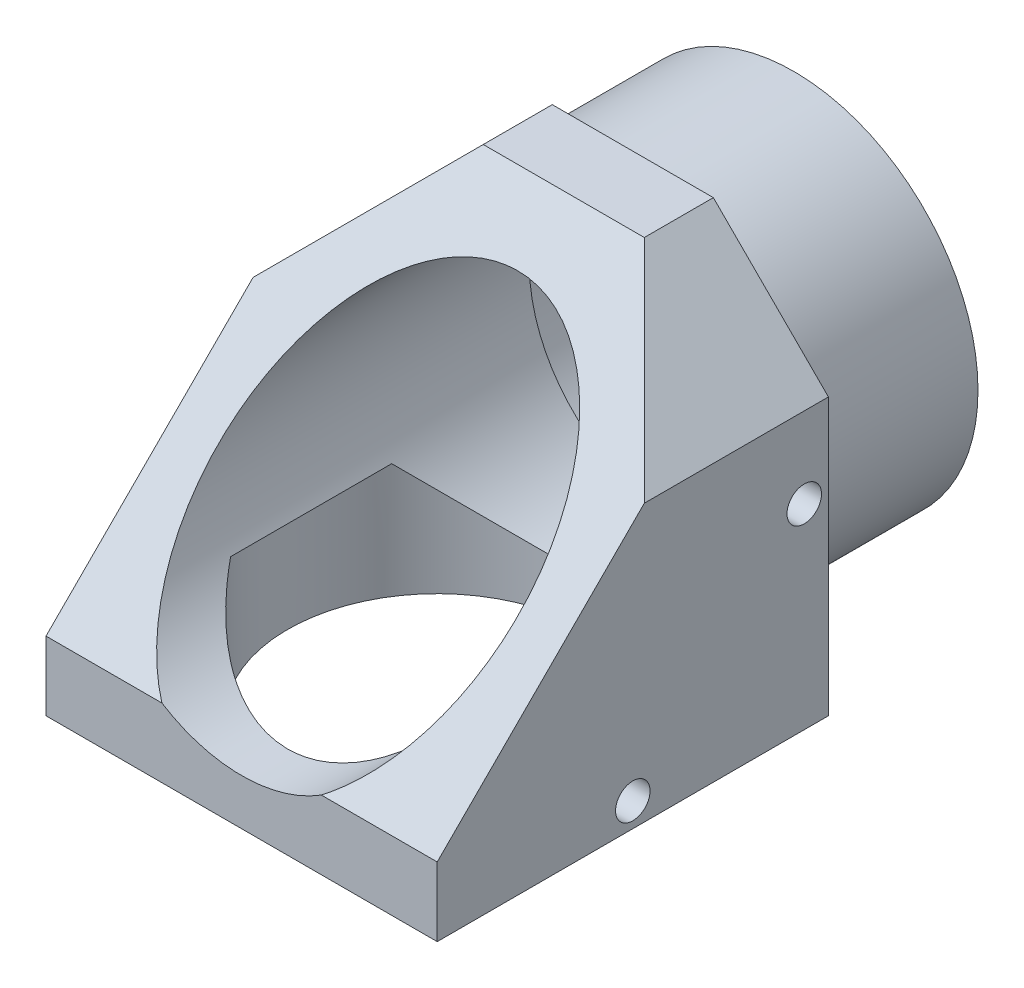
ISO-10303-21;
HEADER;
FILE_DESCRIPTION(('STEP AP214'),'2;1');
FILE_NAME('part.step','',(''),(''),'','','');
FILE_SCHEMA(('AUTOMOTIVE_DESIGN { 1 0 10303 214 1 1 1 1 }'));
ENDSEC;
DATA;
#1=APPLICATION_CONTEXT('core data for automotive mechanical design processes');
#2=APPLICATION_PROTOCOL_DEFINITION('international standard','automotive_design',2000,#1);
#3=PRODUCT_CONTEXT('',#1,'mechanical');
#4=PRODUCT('Part','Part','',(#3));
#5=PRODUCT_RELATED_PRODUCT_CATEGORY('part','',(#4));
#6=PRODUCT_DEFINITION_FORMATION('','',#4);
#7=PRODUCT_DEFINITION_CONTEXT('part definition',#1,'design');
#8=PRODUCT_DEFINITION('design','',#6,#7);
#9=PRODUCT_DEFINITION_SHAPE('','',#8);
#10=(LENGTH_UNIT() NAMED_UNIT(*) SI_UNIT(.MILLI.,.METRE.));
#11=(NAMED_UNIT(*) PLANE_ANGLE_UNIT() SI_UNIT($,.RADIAN.));
#12=(NAMED_UNIT(*) SI_UNIT($,.STERADIAN.) SOLID_ANGLE_UNIT());
#13=UNCERTAINTY_MEASURE_WITH_UNIT(LENGTH_MEASURE(1.E-05),#10,'distance_accuracy_value','');
#14=(GEOMETRIC_REPRESENTATION_CONTEXT(3) GLOBAL_UNCERTAINTY_ASSIGNED_CONTEXT((#13)) GLOBAL_UNIT_ASSIGNED_CONTEXT((#10,
#11,#12)) REPRESENTATION_CONTEXT('',''));
#15=CARTESIAN_POINT('',(0.,0.,0.));
#16=DIRECTION('',(0.,0.,1.));
#17=DIRECTION('',(1.,0.,0.));
#18=AXIS2_PLACEMENT_3D('',#15,#16,#17);
#19=CARTESIAN_POINT('',(17.,-17.0000000000001,-48.));
#20=DIRECTION('',(-1.,0.,0.));
#21=DIRECTION('',(0.,0.,-1.));
#22=AXIS2_PLACEMENT_3D('',#19,#20,#21);
#23=PLANE('',#22);
#24=CARTESIAN_POINT('',(17.,0.,-31.9));
#25=DIRECTION('',(1.,0.,0.));
#26=DIRECTION('',(0.,0.,-1.));
#27=AXIS2_PLACEMENT_3D('',#24,#25,#26);
#28=CIRCLE('',#27,1.5);
#29=CARTESIAN_POINT('',(17.,0.,-33.4));
#30=VERTEX_POINT('',#29);
#31=EDGE_CURVE('E353',#30,#30,#28,.T.);
#32=ORIENTED_EDGE('',*,*,#31,.F.);
#33=EDGE_LOOP('',(#32));
#34=FACE_BOUND('',#33,.T.);
#35=DIRECTION('',(0.,1.,0.));
#36=VECTOR('',#35,1.);
#37=CARTESIAN_POINT('',(17.,-17.0000000000001,-34.));
#38=LINE('',#37,#36);
#39=CARTESIAN_POINT('',(17.,-17.0000000000001,-34.));
#40=VERTEX_POINT('',#39);
#41=CARTESIAN_POINT('',(17.,6.99999999999994,-34.));
#42=VERTEX_POINT('',#41);
#43=EDGE_CURVE('E174',#40,#42,#38,.T.);
#44=ORIENTED_EDGE('',*,*,#43,.T.);
#45=DIRECTION('',(0.,0.,-1.));
#46=VECTOR('',#45,1.);
#47=CARTESIAN_POINT('',(17.,6.99999999999988,-48.));
#48=LINE('',#47,#46);
#49=CARTESIAN_POINT('',(17.,6.99999999999994,-18.0000000000003));
#50=VERTEX_POINT('',#49);
#51=EDGE_CURVE('E226',#50,#42,#48,.T.);
#52=ORIENTED_EDGE('',*,*,#51,.F.);
#53=DIRECTION('',(0.,0.707106781186544,-0.707106781186551));
#54=VECTOR('',#53,1.);
#55=CARTESIAN_POINT('',(17.,17.,-28.0000000000005));
#56=LINE('',#55,#54);
#57=CARTESIAN_POINT('',(17.,-11.0000000000002,0.));
#58=VERTEX_POINT('',#57);
#59=EDGE_CURVE('E45',#58,#50,#56,.T.);
#60=ORIENTED_EDGE('',*,*,#59,.F.);
#61=DIRECTION('',(0.,1.,0.));
#62=VECTOR('',#61,1.);
#63=CARTESIAN_POINT('',(17.,-17.0000000000001,0.));
#64=LINE('',#63,#62);
#65=CARTESIAN_POINT('',(17.,-17.0000000000001,0.));
#66=VERTEX_POINT('',#65);
#67=EDGE_CURVE('E202',#66,#58,#64,.T.);
#68=ORIENTED_EDGE('',*,*,#67,.F.);
#69=DIRECTION('',(0.,0.,1.));
#70=VECTOR('',#69,1.);
#71=CARTESIAN_POINT('',(17.,-17.0000000000001,-48.));
#72=LINE('',#71,#70);
#73=EDGE_CURVE('E210',#40,#66,#72,.T.);
#74=ORIENTED_EDGE('',*,*,#73,.F.);
#75=EDGE_LOOP('',(#44,#52,#60,#68,#74));
#76=FACE_BOUND('',#75,.T.);
#77=CARTESIAN_POINT('',(17.,-14.9,-17.));
#78=DIRECTION('',(1.,0.,0.));
#79=DIRECTION('',(0.,0.,-1.));
#80=AXIS2_PLACEMENT_3D('',#77,#78,#79);
#81=CIRCLE('',#80,1.5);
#82=CARTESIAN_POINT('',(17.,-14.9,-18.5));
#83=VERTEX_POINT('',#82);
#84=EDGE_CURVE('E350',#83,#83,#81,.T.);
#85=ORIENTED_EDGE('',*,*,#84,.F.);
#86=EDGE_LOOP('',(#85));
#87=FACE_BOUND('',#86,.T.);
#88=ADVANCED_FACE('F37',(#34,#76,#87),#23,.F.);
#89=CARTESIAN_POINT('',(0.,-7.00000000000005,-17.));
#90=DIRECTION('',(0.,-1.,0.));
#91=DIRECTION('',(0.,0.,1.));
#92=AXIS2_PLACEMENT_3D('',#89,#90,#91);
#93=CYLINDRICAL_SURFACE('',#92,13.);
#94=CARTESIAN_POINT('',(0.,-17.0000000000001,-17.));
#95=DIRECTION('',(0.,1.,0.));
#96=DIRECTION('',(0.,0.,1.));
#97=AXIS2_PLACEMENT_3D('',#94,#95,#96);
#98=CIRCLE('',#97,13.);
#99=CARTESIAN_POINT('',(0.,-17.0000000000001,-4.));
#100=VERTEX_POINT('',#99);
#101=EDGE_CURVE('E179',#100,#100,#98,.T.);
#102=ORIENTED_EDGE('',*,*,#101,.F.);
#103=EDGE_LOOP('',(#102));
#104=FACE_BOUND('',#103,.T.);
#105=CARTESIAN_POINT('',(0.,0.,-17.));
#106=DIRECTION('',(0.,0.707106781186547,-0.707106781186547));
#107=DIRECTION('',(0.,0.707106781186548,0.707106781186547));
#108=AXIS2_PLACEMENT_3D('',#105,#106,#107);
#109=ELLIPSE('',#108,18.3847763108502,13.);
#110=CARTESIAN_POINT('',(-10.9544511501034,-7.00000000000005,-24.));
#111=VERTEX_POINT('',#110);
#112=CARTESIAN_POINT('',(10.9544511501033,-7.00000000000002,-24.));
#113=VERTEX_POINT('',#112);
#114=EDGE_CURVE('E189',#111,#113,#109,.F.);
#115=ORIENTED_EDGE('',*,*,#114,.F.);
#116=CARTESIAN_POINT('',(0.,-7.00000000000005,-17.));
#117=DIRECTION('',(0.,1.,0.));
#118=DIRECTION('',(0.,0.,1.));
#119=AXIS2_PLACEMENT_3D('',#116,#117,#118);
#120=CIRCLE('',#119,13.);
#121=CARTESIAN_POINT('',(-10.9544511501034,-7.00000000000005,-9.99999999999998));
#122=VERTEX_POINT('',#121);
#123=EDGE_CURVE('E184',#111,#122,#120,.T.);
#124=ORIENTED_EDGE('',*,*,#123,.T.);
#125=CARTESIAN_POINT('',(0.,0.,-17.));
#126=DIRECTION('',(0.,-0.707106781186548,-0.707106781186547));
#127=DIRECTION('',(0.,-0.707106781186547,0.707106781186547));
#128=AXIS2_PLACEMENT_3D('',#125,#126,#127);
#129=ELLIPSE('',#128,18.3847763108502,13.);
#130=CARTESIAN_POINT('',(10.9544511501033,-7.00000000000006,-9.99999999999998));
#131=VERTEX_POINT('',#130);
#132=EDGE_CURVE('E183',#131,#122,#129,.T.);
#133=ORIENTED_EDGE('',*,*,#132,.F.);
#134=EDGE_CURVE('E180',#131,#113,#120,.T.);
#135=ORIENTED_EDGE('',*,*,#134,.T.);
#136=EDGE_LOOP('',(#115,#124,#133,#135));
#137=FACE_BOUND('',#136,.T.);
#138=CARTESIAN_POINT('',(12.9131715701449,-14.9,-18.5));
#139=CARTESIAN_POINT('',(12.9131726932068,-14.9839542172997,-18.4999964013091));
#140=CARTESIAN_POINT('',(12.9139991388253,-15.0679621566454,-18.4929279243701));
#141=CARTESIAN_POINT('',(12.9172147015517,-15.2336437023459,-18.4648400830477));
#142=CARTESIAN_POINT('',(12.9196054881851,-15.3153147173395,-18.4438058134747));
#143=CARTESIAN_POINT('',(12.9256754079296,-15.4738994148837,-18.3884115875902));
#144=CARTESIAN_POINT('',(12.9293537048583,-15.5508161470808,-18.3540602785695));
#145=CARTESIAN_POINT('',(12.9375831784509,-15.6977775575172,-18.2730248511306));
#146=CARTESIAN_POINT('',(12.9421341959707,-15.7678234851614,-18.226342980656));
#147=CARTESIAN_POINT('',(12.9516207455651,-15.8994057764391,-18.1217317645875));
#148=CARTESIAN_POINT('',(12.9565578374542,-15.9609045029651,-18.0637552146803));
#149=CARTESIAN_POINT('',(12.9662461748247,-16.0733219524831,-17.9383017639823));
#150=CARTESIAN_POINT('',(12.9709974113621,-16.1242401668117,-17.8708244066972));
#151=CARTESIAN_POINT('',(12.9797944757482,-16.2141844677572,-17.7280503313319));
#152=CARTESIAN_POINT('',(12.98383828536,-16.2531767600233,-17.6527321886752));
#153=CARTESIAN_POINT('',(12.9907477847743,-16.3179460292017,-17.4965625894714));
#154=CARTESIAN_POINT('',(12.9936135121185,-16.3437234272362,-17.4157113093432));
#155=CARTESIAN_POINT('',(12.997832983891,-16.3812194665391,-17.2511539028343));
#156=CARTESIAN_POINT('',(12.9991934291785,-16.3930004312582,-17.1674621520276));
#157=CARTESIAN_POINT('',(13.0002718988949,-16.4023622088192,-16.9992791279829));
#158=CARTESIAN_POINT('',(12.9999899789058,-16.3999435022151,-16.9147878818985));
#159=CARTESIAN_POINT('',(12.9978209293695,-16.381024804668,-16.7478279018511));
#160=CARTESIAN_POINT('',(12.9959414402013,-16.3645918357374,-16.6653514602571));
#161=CARTESIAN_POINT('',(12.9907970880194,-16.3182157078116,-16.5043349442444));
#162=CARTESIAN_POINT('',(12.9875322020161,-16.2882723246206,-16.4257949351719));
#163=CARTESIAN_POINT('',(12.9799708183318,-16.2156531717194,-16.2746717067593));
#164=CARTESIAN_POINT('',(12.9756719534236,-16.1729481298311,-16.2021026768103));
#165=CARTESIAN_POINT('',(12.966524152931,-16.0760391745798,-16.0651361789808));
#166=CARTESIAN_POINT('',(12.9616751958488,-16.0218348117465,-16.0007390306694));
#167=CARTESIAN_POINT('',(12.9519371499703,-15.9030898527588,-15.8815510257837));
#168=CARTESIAN_POINT('',(12.9470479919323,-15.8384908889184,-15.8268183090959));
#169=CARTESIAN_POINT('',(12.9378085801023,-15.7009917205283,-15.7289639732215));
#170=CARTESIAN_POINT('',(12.9334583275811,-15.6280914964038,-15.6858423814153));
#171=CARTESIAN_POINT('',(12.9257891770563,-15.4760103025,-15.6124325217978));
#172=CARTESIAN_POINT('',(12.9224706181887,-15.396827278166,-15.5821484727286));
#173=CARTESIAN_POINT('',(12.9172473972585,-15.2344531233975,-15.535322621253));
#174=CARTESIAN_POINT('',(12.9153426774327,-15.1512621568575,-15.5187802574186));
#175=CARTESIAN_POINT('',(12.9131731548214,-14.9837458232959,-15.4999834407579));
#176=CARTESIAN_POINT('',(12.9128989839497,-14.899429731566,-15.4976473659746));
#177=CARTESIAN_POINT('',(12.9139968511577,-14.7316073630657,-15.5071144904687));
#178=CARTESIAN_POINT('',(12.9153688594531,-14.6481010716711,-15.5189174339285));
#179=CARTESIAN_POINT('',(12.9195959589165,-14.4845105904106,-15.5562590054518));
#180=CARTESIAN_POINT('',(12.9224468231212,-14.4044173475113,-15.5817584924786));
#181=CARTESIAN_POINT('',(12.9293069915862,-14.2496440469503,-15.6457291608637));
#182=CARTESIAN_POINT('',(12.9333163307988,-14.1749641526995,-15.6842007336076));
#183=CARTESIAN_POINT('',(12.9420642431406,-14.0327670205826,-15.7732257421032));
#184=CARTESIAN_POINT('',(12.9468060265184,-13.9652836386942,-15.8238329345565));
#185=CARTESIAN_POINT('',(12.9564743034368,-13.8397397077759,-15.9356162064136));
#186=CARTESIAN_POINT('',(12.9614008030784,-13.7816794703229,-15.9967926351518));
#187=CARTESIAN_POINT('',(12.9709120031807,-13.6763453756226,-16.1283333588313));
#188=CARTESIAN_POINT('',(12.9754949370269,-13.6291249942273,-16.198740621529));
#189=CARTESIAN_POINT('',(12.9837765169352,-13.5471802030376,-16.3465341184599));
#190=CARTESIAN_POINT('',(12.9874751785286,-13.5124555737648,-16.423920230085));
#191=CARTESIAN_POINT('',(12.9935635841,-13.4565772477665,-16.5832933505922));
#192=CARTESIAN_POINT('',(12.9959563619373,-13.4353920760901,-16.6652692032788));
#193=CARTESIAN_POINT('',(12.9991759401563,-13.4070914991468,-16.8316437294043));
#194=CARTESIAN_POINT('',(13.0000028001968,-13.3999755578652,-16.9160423104169));
#195=CARTESIAN_POINT('',(12.9999972013656,-13.4000244275846,-17.0843431264141));
#196=CARTESIAN_POINT('',(12.9991743496425,-13.4071065556679,-17.1682453978403));
#197=CARTESIAN_POINT('',(12.9959808096935,-13.4351761221973,-17.3336592169468));
#198=CARTESIAN_POINT('',(12.9936101215025,-13.4561635603309,-17.4151707646809));
#199=CARTESIAN_POINT('',(12.9875862426145,-13.5114232435689,-17.5734826057158));
#200=CARTESIAN_POINT('',(12.9839333745424,-13.54569214699,-17.65028407847));
#201=CARTESIAN_POINT('',(12.9757507257432,-13.6265333985612,-17.797058803003));
#202=CARTESIAN_POINT('',(12.9712209408992,-13.6731058044754,-17.8670320227216));
#203=CARTESIAN_POINT('',(12.9617593260845,-13.7775399165321,-17.9985870950489));
#204=CARTESIAN_POINT('',(12.9568253919963,-13.8354632203995,-18.0601198995243));
#205=CARTESIAN_POINT('',(12.9471288614201,-13.9608287274507,-18.1726259529445));
#206=CARTESIAN_POINT('',(12.9423663059907,-14.0282731928934,-18.2235966851828));
#207=CARTESIAN_POINT('',(12.9335349717853,-14.1710185374043,-18.3136721475152));
#208=CARTESIAN_POINT('',(12.9294685391664,-14.2463446575214,-18.3527370834638));
#209=CARTESIAN_POINT('',(12.9225174865264,-14.4024900799745,-18.4176092060689));
#210=CARTESIAN_POINT('',(12.9196315622315,-14.48330320427,-18.443431032304));
#211=CARTESIAN_POINT('',(12.9160801955002,-14.6204594284936,-18.4747957085219));
#212=CARTESIAN_POINT('',(12.9149947793777,-14.6759322719504,-18.4842340066211));
#213=CARTESIAN_POINT('',(12.9135400928901,-14.7875953845718,-18.4968373380594));
#214=CARTESIAN_POINT('',(12.9131708181613,-14.8437856493629,-18.5000024096237));
#215=CARTESIAN_POINT('',(12.9131715701449,-14.9,-18.5));
#216=B_SPLINE_CURVE_WITH_KNOTS('',3,(#138,#139,#140,#141,#142,#143,#144,#145,#146,#147,#148,
#149,#150,#151,#152,#153,#154,#155,#156,#157,#158,#159,#160,#161,#162,#163,#164,#165,#166,#167,
#168,#169,#170,#171,#172,#173,#174,#175,#176,#177,#178,#179,#180,#181,#182,#183,#184,#185,#186,
#187,#188,#189,#190,#191,#192,#193,#194,#195,#196,#197,#198,#199,#200,#201,#202,#203,#204,#205,
#206,#207,#208,#209,#210,#211,#212,#213,#214,#215),.UNSPECIFIED.,.T.,.F.,(4,2,2,2,2,2,2,2,2,2,2,
2,2,2,2,2,2,2,2,2,2,2,2,2,2,2,2,2,2,2,2,2,2,2,2,2,2,2,4),(0.,0.25165732370461,0.503583664907433,
0.755346693442458,1.00706385553886,1.25985651676711,1.5126613283139,1.76617601105996,
2.01968261449443,2.27205611924455,2.52442108306367,2.77558585790614,3.02675480080053,
3.27850434573874,3.53026373254707,3.78348957406516,4.03671601271496,4.29002560360385,
4.54332484481022,4.79516737460205,5.0470053478671,5.29812743542829,5.54925710036775,
5.80152043045275,6.05379209994299,6.30728275635408,6.56076896017989,6.81366372459469,
7.06654885394691,7.31796557646896,7.5693822933401,7.82073579352366,8.0720904738142,
8.32484896253006,8.57766760888503,8.83132224048158,9.08469586220932,9.25320245654525,
9.42170802410546),.UNSPECIFIED.);
#217=CARTESIAN_POINT('',(12.9131715701449,-14.9,-18.5));
#218=VERTEX_POINT('',#217);
#219=EDGE_CURVE('E348',#218,#218,#216,.T.);
#220=ORIENTED_EDGE('',*,*,#219,.F.);
#221=EDGE_LOOP('',(#220));
#222=FACE_BOUND('',#221,.T.);
#223=ADVANCED_FACE('F274',(#104,#137,#222),#93,.F.);
#224=CARTESIAN_POINT('',(0.,0.,-48.));
#225=DIRECTION('',(0.,0.,1.));
#226=DIRECTION('',(-1.,0.,0.));
#227=AXIS2_PLACEMENT_3D('',#224,#225,#226);
#228=CYLINDRICAL_SURFACE('',#227,13.);
#229=ORIENTED_EDGE('',*,*,#114,.T.);
#230=DIRECTION('',(0.,0.,1.));
#231=VECTOR('',#230,1.);
#232=CARTESIAN_POINT('',(10.9544511501033,-7.00000000000008,-48.));
#233=LINE('',#232,#231);
#234=EDGE_CURVE('E216',#131,#113,#233,.F.);
#235=ORIENTED_EDGE('',*,*,#234,.F.);
#236=ORIENTED_EDGE('',*,*,#132,.T.);
#237=DIRECTION('',(0.,0.,1.));
#238=VECTOR('',#237,1.);
#239=CARTESIAN_POINT('',(-10.9544511501034,-7.00000000000002,-48.));
#240=LINE('',#239,#238);
#241=EDGE_CURVE('E220',#111,#122,#240,.T.);
#242=ORIENTED_EDGE('',*,*,#241,.F.);
#243=EDGE_LOOP('',(#229,#235,#236,#242));
#244=FACE_BOUND('',#243,.T.);
#245=CARTESIAN_POINT('',(0.,0.,0.));
#246=DIRECTION('',(0.,0.,1.));
#247=DIRECTION('',(1.,0.,0.));
#248=AXIS2_PLACEMENT_3D('',#245,#246,#247);
#249=CIRCLE('',#248,13.);
#250=CARTESIAN_POINT('',(-6.92820323027521,-11.0000000000002,0.));
#251=VERTEX_POINT('',#250);
#252=CARTESIAN_POINT('',(6.92820323027515,-11.0000000000002,0.));
#253=VERTEX_POINT('',#252);
#254=EDGE_CURVE('E199',#251,#253,#249,.T.);
#255=ORIENTED_EDGE('',*,*,#254,.T.);
#256=CARTESIAN_POINT('',(0.,0.,-11.0000000000003));
#257=DIRECTION('',(0.,-0.707106781186551,-0.707106781186543));
#258=DIRECTION('',(0.,-0.707106781186544,0.707106781186551));
#259=AXIS2_PLACEMENT_3D('',#256,#257,#258);
#260=ELLIPSE('',#259,18.3847763108503,13.);
#261=EDGE_CURVE('E243',#251,#253,#260,.T.);
#262=ORIENTED_EDGE('',*,*,#261,.F.);
#263=EDGE_LOOP('',(#255,#262));
#264=FACE_BOUND('',#263,.T.);
#265=CARTESIAN_POINT('',(0.,0.,-38.));
#266=DIRECTION('',(0.,0.,1.));
#267=DIRECTION('',(1.,0.,0.));
#268=AXIS2_PLACEMENT_3D('',#265,#266,#267);
#269=CIRCLE('',#268,13.);
#270=CARTESIAN_POINT('',(12.9999999999999,0.,-38.));
#271=VERTEX_POINT('',#270);
#272=EDGE_CURVE('E196',#271,#271,#269,.T.);
#273=ORIENTED_EDGE('',*,*,#272,.F.);
#274=EDGE_LOOP('',(#273));
#275=FACE_BOUND('',#274,.T.);
#276=CARTESIAN_POINT('',(13.,0.,-33.4));
#277=CARTESIAN_POINT('',(12.9999989044515,0.0839563147427269,-33.3999964031671));
#278=CARTESIAN_POINT('',(12.9991780815721,0.167966345196167,-33.3929275849652));
#279=CARTESIAN_POINT('',(12.995982599614,0.333652235419356,-33.3648382649666));
#280=CARTESIAN_POINT('',(12.99360628136,0.415325505475647,-33.3438028653164));
#281=CARTESIAN_POINT('',(12.9875677351869,0.573914972249207,-33.2884053338573));
#282=CARTESIAN_POINT('',(12.9839063366206,0.650834199520668,-33.2540517956906));
#283=CARTESIAN_POINT('',(12.9757057473599,0.797799793787114,-33.1730111181213));
#284=CARTESIAN_POINT('',(12.9711667170809,0.867847413269111,-33.1263262321012));
#285=CARTESIAN_POINT('',(12.9616943551208,0.999427807179217,-33.0217119644012));
#286=CARTESIAN_POINT('',(12.9567594432832,1.06092347729179,-32.9637360526227));
#287=CARTESIAN_POINT('',(12.9470643855765,1.17333502414492,-32.8382851632475));
#288=CARTESIAN_POINT('',(12.9423042482743,1.22425038284187,-32.7708097207966));
#289=CARTESIAN_POINT('',(12.9334819604022,1.31419168733337,-32.6280373361048));
#290=CARTESIAN_POINT('',(12.9294218388056,1.35318331715726,-32.5527186399223));
#291=CARTESIAN_POINT('',(12.9224797052986,1.41795120910935,-32.3965478380412));
#292=CARTESIAN_POINT('',(12.9195976551561,1.44372790011124,-32.3156959120129));
#293=CARTESIAN_POINT('',(12.9153528047107,1.48122247723764,-32.1511364753763));
#294=CARTESIAN_POINT('',(12.9139832786549,1.49300261981043,-32.0674433262594));
#295=CARTESIAN_POINT('',(12.9128978570992,1.50236226854611,-31.8992575604559));
#296=CARTESIAN_POINT('',(12.9131819045903,1.49994226427624,-31.8147649714311));
#297=CARTESIAN_POINT('',(12.9153653842397,1.48102150197292,-31.6478106867289));
#298=CARTESIAN_POINT('',(12.9172569773873,1.46458907258949,-31.5653411304074));
#299=CARTESIAN_POINT('',(12.9224301836669,1.41821640637184,-31.4043381059818));
#300=CARTESIAN_POINT('',(12.9257118211341,1.38827593305337,-31.3258047068143));
#301=CARTESIAN_POINT('',(12.9333043079058,1.31566282618378,-31.1746895307639));
#302=CARTESIAN_POINT('',(12.9376175732259,1.27296024500282,-31.1021222704977));
#303=CARTESIAN_POINT('',(12.9467853893456,1.17605655290092,-30.9651582704928));
#304=CARTESIAN_POINT('',(12.9516399612475,1.1218549936306,-30.9007618494945));
#305=CARTESIAN_POINT('',(12.9613782949516,1.00311203599147,-30.7815707161917));
#306=CARTESIAN_POINT('',(12.9662620604919,0.938511694342099,-30.7268347087021));
#307=CARTESIAN_POINT('',(12.9754816969276,0.801008592235985,-30.6289743878324));
#308=CARTESIAN_POINT('',(12.9798175668566,0.728105817136063,-30.5858500949327));
#309=CARTESIAN_POINT('',(12.9874550212077,0.576023905679844,-30.5124382871552));
#310=CARTESIAN_POINT('',(12.9907563324875,0.496843118716597,-30.4821541615714));
#311=CARTESIAN_POINT('',(12.9959501177405,0.334473831095718,-30.4353274726576));
#312=CARTESIAN_POINT('',(12.9978426478647,0.251285490311355,-30.418784361637));
#313=CARTESIAN_POINT('',(12.999998373659,0.0837704200049993,-30.3999847236204));
#314=CARTESIAN_POINT('',(13.0002707984128,-0.000547113543221205,-30.3976472710681));
#315=CARTESIAN_POINT('',(12.9991804669134,-0.168372695685032,-30.407112154611));
#316=CARTESIAN_POINT('',(12.9978177402297,-0.251880758889253,-30.4189142350122));
#317=CARTESIAN_POINT('',(12.993616027243,-0.415480266956191,-30.456255972808));
#318=CARTESIAN_POINT('',(12.9907811576039,-0.495580568872927,-30.4817573287087));
#319=CARTESIAN_POINT('',(12.9839527929212,-0.650367161714392,-30.545734096229));
#320=CARTESIAN_POINT('',(12.9799592639146,-0.725053293857149,-30.5842098881644));
#321=CARTESIAN_POINT('',(12.9712363785455,-0.867254744569807,-30.6732411451229));
#322=CARTESIAN_POINT('',(12.9665038451426,-0.934736878832517,-30.7238492959128));
#323=CARTESIAN_POINT('',(12.9568430886348,-1.06027784673841,-30.8356337448151));
#324=CARTESIAN_POINT('',(12.9519148589511,-1.11833636324618,-30.8968103984492));
#325=CARTESIAN_POINT('',(12.9423899602444,-1.22366664140003,-31.028350385336));
#326=CARTESIAN_POINT('',(12.9377950067668,-1.27088497439803,-31.0987566435089));
#327=CARTESIAN_POINT('',(12.9294843210235,-1.3528261731532,-31.2465475758449));
#328=CARTESIAN_POINT('',(12.9257685733743,-1.38754925754464,-31.3239321278765));
#329=CARTESIAN_POINT('',(12.9196483466478,-1.44342658284104,-31.4833061537355));
#330=CARTESIAN_POINT('',(12.91724089246,-1.46461162925539,-31.5652847079303));
#331=CARTESIAN_POINT('',(12.9140010380224,-1.4929110406227,-31.7316649395143));
#332=CARTESIAN_POINT('',(12.9131685761467,-1.5000259561095,-31.8160665219645));
#333=CARTESIAN_POINT('',(12.913174563178,-1.49997405326829,-31.9843656537594));
#334=CARTESIAN_POINT('',(12.9140031925958,-1.49289116482705,-32.068263241811));
#335=CARTESIAN_POINT('',(12.9172169582805,-1.46482172327177,-32.2336675019932));
#336=CARTESIAN_POINT('',(12.9196020954322,-1.44383516225565,-32.315174172765));
#337=CARTESIAN_POINT('',(12.9256572251488,-1.38857911797313,-32.4734760916893));
#338=CARTESIAN_POINT('',(12.9293268880955,-1.35431304208046,-32.5502725425812));
#339=CARTESIAN_POINT('',(12.9375381901497,-1.27347900341472,-32.6970384003879));
#340=CARTESIAN_POINT('',(12.9420798337501,-1.22691097725308,-32.7670077721221));
#341=CARTESIAN_POINT('',(12.9515555600008,-1.12248173071091,-32.8985629533293));
#342=CARTESIAN_POINT('',(12.9564917239034,-1.06455790771253,-32.960098921175));
#343=CARTESIAN_POINT('',(12.9661816355574,-0.939190054186341,-33.0726111148908));
#344=CARTESIAN_POINT('',(12.9709353397598,-0.871743768617598,-33.1235848324088));
#345=CARTESIAN_POINT('',(12.9797415177439,-0.728996893197141,-33.2136635640703));
#346=CARTESIAN_POINT('',(12.9837916526637,-0.653671391511472,-33.2527293056854));
#347=CARTESIAN_POINT('',(12.9907101076694,-0.497527270565922,-33.3176031050395));
#348=CARTESIAN_POINT('',(12.993579731148,-0.416714824913427,-33.3434257921356));
#349=CARTESIAN_POINT('',(12.9971099824635,-0.279556305332071,-33.3747928548381));
#350=CARTESIAN_POINT('',(12.9981885527758,-0.224080319679984,-33.3842322271337));
#351=CARTESIAN_POINT('',(12.9996339262189,-0.112410914672208,-33.3968369852807));
#352=CARTESIAN_POINT('',(13.0000007335839,-0.0562174995863383,-33.4000024084544));
#353=CARTESIAN_POINT('',(13.,0.,-33.4));
#354=B_SPLINE_CURVE_WITH_KNOTS('',3,(#276,#277,#278,#279,#280,#281,#282,#283,#284,#285,#286,
#287,#288,#289,#290,#291,#292,#293,#294,#295,#296,#297,#298,#299,#300,#301,#302,#303,#304,#305,
#306,#307,#308,#309,#310,#311,#312,#313,#314,#315,#316,#317,#318,#319,#320,#321,#322,#323,#324,
#325,#326,#327,#328,#329,#330,#331,#332,#333,#334,#335,#336,#337,#338,#339,#340,#341,#342,#343,
#344,#345,#346,#347,#348,#349,#350,#351,#352,#353),.UNSPECIFIED.,.T.,.F.,(4,2,2,2,2,2,2,2,2,2,2,
2,2,2,2,2,2,2,2,2,2,2,2,2,2,2,2,2,2,2,2,2,2,2,2,2,2,2,4),(0.,0.251663624421975,
0.503596125244163,0.755366334321087,1.00709056767771,1.25987498270023,1.51267177188699,
1.7661893968867,2.01969879377991,2.2720763120158,2.52444512928253,2.77559031440107,
3.02673989646909,3.2784835178067,3.53023695652506,3.7834711988091,4.03670588773469,
4.29000737900443,4.54329877367691,4.79514587715499,5.04698842639316,5.29813049175019,
5.54927991940193,5.80154039645153,6.05380936112789,6.307296210909,6.56077862511547,
6.81368217226278,7.06657582364481,7.3179789106833,7.56938214060556,7.82072090595904,
8.07206096641735,8.32482769676522,8.57765438622355,8.83130609524227,9.08467699305619,
9.25319301127892,9.42170802703667),.UNSPECIFIED.);
#355=CARTESIAN_POINT('',(13.,0.,-33.4));
#356=VERTEX_POINT('',#355);
#357=EDGE_CURVE('E370',#356,#356,#354,.T.);
#358=ORIENTED_EDGE('',*,*,#357,.T.);
#359=EDGE_LOOP('',(#358));
#360=FACE_BOUND('',#359,.T.);
#361=ADVANCED_FACE('F280',(#244,#264,#275,#360),#228,.F.);
#362=CARTESIAN_POINT('',(0.,0.,-38.));
#363=DIRECTION('',(0.,0.,-1.));
#364=DIRECTION('',(1.,0.,0.));
#365=AXIS2_PLACEMENT_3D('',#362,#363,#364);
#366=CYLINDRICAL_SURFACE('',#365,13.5);
#367=CARTESIAN_POINT('',(0.,0.,-46.));
#368=DIRECTION('',(0.,0.,-1.));
#369=DIRECTION('',(-1.,0.,0.));
#370=AXIS2_PLACEMENT_3D('',#367,#368,#369);
#371=CIRCLE('',#370,13.5);
#372=CARTESIAN_POINT('',(-13.5,0.,-46.));
#373=VERTEX_POINT('',#372);
#374=EDGE_CURVE('E375',#373,#373,#371,.T.);
#375=ORIENTED_EDGE('',*,*,#374,.T.);
#376=EDGE_LOOP('',(#375));
#377=FACE_BOUND('',#376,.T.);
#378=CARTESIAN_POINT('',(0.,0.,-38.));
#379=DIRECTION('',(0.,0.,1.));
#380=DIRECTION('',(1.,0.,0.));
#381=AXIS2_PLACEMENT_3D('',#378,#379,#380);
#382=CIRCLE('',#381,13.5);
#383=CARTESIAN_POINT('',(13.4999999999999,0.,-38.));
#384=VERTEX_POINT('',#383);
#385=EDGE_CURVE('E193',#384,#384,#382,.T.);
#386=ORIENTED_EDGE('',*,*,#385,.T.);
#387=EDGE_LOOP('',(#386));
#388=FACE_BOUND('',#387,.T.);
#389=ADVANCED_FACE('F321',(#377,#388),#366,.F.);
#390=CARTESIAN_POINT('',(17.,17.,-48.));
#391=DIRECTION('',(0.,0.,1.));
#392=DIRECTION('',(-1.,0.,0.));
#393=AXIS2_PLACEMENT_3D('',#390,#391,#392);
#394=PLANE('',#393);
#395=CARTESIAN_POINT('',(0.,0.,-48.));
#396=DIRECTION('',(0.,0.,1.));
#397=DIRECTION('',(1.,0.,0.));
#398=AXIS2_PLACEMENT_3D('',#395,#396,#397);
#399=CIRCLE('',#398,13.5);
#400=CARTESIAN_POINT('',(13.5,0.,-48.));
#401=VERTEX_POINT('',#400);
#402=EDGE_CURVE('E192',#401,#401,#399,.T.);
#403=ORIENTED_EDGE('',*,*,#402,.T.);
#404=EDGE_LOOP('',(#403));
#405=FACE_BOUND('',#404,.T.);
#406=CARTESIAN_POINT('',(0.,0.,-48.));
#407=DIRECTION('',(0.,0.,1.));
#408=DIRECTION('',(1.,0.,0.));
#409=AXIS2_PLACEMENT_3D('',#406,#407,#408);
#410=CIRCLE('',#409,16.);
#411=CARTESIAN_POINT('',(16.,0.,-48.));
#412=VERTEX_POINT('',#411);
#413=EDGE_CURVE('E159',#412,#412,#410,.T.);
#414=ORIENTED_EDGE('',*,*,#413,.F.);
#415=EDGE_LOOP('',(#414));
#416=FACE_BOUND('',#415,.T.);
#417=ADVANCED_FACE('F318',(#405,#416),#394,.F.);
#418=CARTESIAN_POINT('',(-17.,16.9999999999999,-48.));
#419=DIRECTION('',(0.,-1.,0.));
#420=DIRECTION('',(0.,0.,1.));
#421=AXIS2_PLACEMENT_3D('',#418,#419,#420);
#422=PLANE('',#421);
#423=DIRECTION('',(-1.,0.,0.));
#424=VECTOR('',#423,1.);
#425=CARTESIAN_POINT('',(17.,17.,-34.));
#426=LINE('',#425,#424);
#427=CARTESIAN_POINT('',(6.99999999999995,17.,-34.));
#428=VERTEX_POINT('',#427);
#429=CARTESIAN_POINT('',(-7.00000000000001,16.9999999999999,-34.));
#430=VERTEX_POINT('',#429);
#431=EDGE_CURVE('E163',#428,#430,#426,.T.);
#432=ORIENTED_EDGE('',*,*,#431,.T.);
#433=DIRECTION('',(0.,0.,-1.));
#434=VECTOR('',#433,1.);
#435=CARTESIAN_POINT('',(-6.99999999999995,16.9999999999999,-48.));
#436=LINE('',#435,#434);
#437=CARTESIAN_POINT('',(-6.99999999999995,16.9999999999999,-28.0000000000005));
#438=VERTEX_POINT('',#437);
#439=EDGE_CURVE('E222',#438,#430,#436,.T.);
#440=ORIENTED_EDGE('',*,*,#439,.F.);
#441=DIRECTION('',(-1.,0.,0.));
#442=VECTOR('',#441,1.);
#443=CARTESIAN_POINT('',(-6.99999999999995,16.9999999999999,-28.0000000000005));
#444=LINE('',#443,#442);
#445=CARTESIAN_POINT('',(6.99999999999995,16.9999999999999,-28.0000000000005));
#446=VERTEX_POINT('',#445);
#447=EDGE_CURVE('E231',#446,#438,#444,.T.);
#448=ORIENTED_EDGE('',*,*,#447,.F.);
#449=DIRECTION('',(0.,0.,1.));
#450=VECTOR('',#449,1.);
#451=CARTESIAN_POINT('',(6.99999999999995,17.,-48.));
#452=LINE('',#451,#450);
#453=EDGE_CURVE('E224',#428,#446,#452,.T.);
#454=ORIENTED_EDGE('',*,*,#453,.F.);
#455=EDGE_LOOP('',(#432,#440,#448,#454));
#456=FACE_BOUND('',#455,.T.);
#457=ADVANCED_FACE('F257',(#456),#422,.F.);
#458=CARTESIAN_POINT('',(-17.,-17.0000000000001,-48.));
#459=DIRECTION('',(1.,0.,0.));
#460=DIRECTION('',(0.,0.,1.));
#461=AXIS2_PLACEMENT_3D('',#458,#459,#460);
#462=PLANE('',#461);
#463=DIRECTION('',(0.,-1.,0.));
#464=VECTOR('',#463,1.);
#465=CARTESIAN_POINT('',(-17.,6.99999999999996,-34.));
#466=LINE('',#465,#464);
#467=CARTESIAN_POINT('',(-17.,6.99999999999996,-34.));
#468=VERTEX_POINT('',#467);
#469=CARTESIAN_POINT('',(-17.,-17.,-34.));
#470=VERTEX_POINT('',#469);
#471=EDGE_CURVE('E169',#468,#470,#466,.T.);
#472=ORIENTED_EDGE('',*,*,#471,.T.);
#473=DIRECTION('',(0.,0.,1.));
#474=VECTOR('',#473,1.);
#475=CARTESIAN_POINT('',(-17.,-17.0000000000001,-48.));
#476=LINE('',#475,#474);
#477=CARTESIAN_POINT('',(-17.,-17.,0.));
#478=VERTEX_POINT('',#477);
#479=EDGE_CURVE('E213',#470,#478,#476,.T.);
#480=ORIENTED_EDGE('',*,*,#479,.T.);
#481=DIRECTION('',(0.,-1.,0.));
#482=VECTOR('',#481,1.);
#483=CARTESIAN_POINT('',(-17.,-17.,0.));
#484=LINE('',#483,#482);
#485=CARTESIAN_POINT('',(-17.,-11.0000000000002,0.));
#486=VERTEX_POINT('',#485);
#487=EDGE_CURVE('E205',#486,#478,#484,.T.);
#488=ORIENTED_EDGE('',*,*,#487,.F.);
#489=DIRECTION('',(0.,-0.707106781186544,0.707106781186551));
#490=VECTOR('',#489,1.);
#491=CARTESIAN_POINT('',(-17.,17.,-28.0000000000005));
#492=LINE('',#491,#490);
#493=CARTESIAN_POINT('',(-17.,6.99999999999999,-18.0000000000004));
#494=VERTEX_POINT('',#493);
#495=EDGE_CURVE('E236',#494,#486,#492,.T.);
#496=ORIENTED_EDGE('',*,*,#495,.F.);
#497=DIRECTION('',(0.,0.,1.));
#498=VECTOR('',#497,1.);
#499=CARTESIAN_POINT('',(-17.,6.99999999999994,-48.));
#500=LINE('',#499,#498);
#501=EDGE_CURVE('E228',#468,#494,#500,.T.);
#502=ORIENTED_EDGE('',*,*,#501,.F.);
#503=EDGE_LOOP('',(#472,#480,#488,#496,#502));
#504=FACE_BOUND('',#503,.T.);
#505=ADVANCED_FACE('F303',(#504),#462,.F.);
#506=CARTESIAN_POINT('',(-17.,-17.0000000000001,-48.));
#507=DIRECTION('',(0.,1.,0.));
#508=DIRECTION('',(0.,0.,-1.));
#509=AXIS2_PLACEMENT_3D('',#506,#507,#508);
#510=PLANE('',#509);
#511=CARTESIAN_POINT('',(13.,-17.0000000000001,-30.));
#512=DIRECTION('',(0.,1.,0.));
#513=DIRECTION('',(0.,0.,1.));
#514=AXIS2_PLACEMENT_3D('',#511,#512,#513);
#515=CIRCLE('',#514,1.64999999999999);
#516=CARTESIAN_POINT('',(13.,-17.0000000000001,-28.35));
#517=VERTEX_POINT('',#516);
#518=EDGE_CURVE('E135',#517,#517,#515,.T.);
#519=ORIENTED_EDGE('',*,*,#518,.T.);
#520=EDGE_LOOP('',(#519));
#521=FACE_BOUND('',#520,.T.);
#522=CARTESIAN_POINT('',(13.,-17.0000000000001,-4.00000000000002));
#523=DIRECTION('',(0.,1.,0.));
#524=DIRECTION('',(0.,0.,1.));
#525=AXIS2_PLACEMENT_3D('',#522,#523,#524);
#526=CIRCLE('',#525,1.64999999999999);
#527=CARTESIAN_POINT('',(13.,-17.0000000000001,-2.35000000000003));
#528=VERTEX_POINT('',#527);
#529=EDGE_CURVE('E134',#528,#528,#526,.T.);
#530=ORIENTED_EDGE('',*,*,#529,.T.);
#531=EDGE_LOOP('',(#530));
#532=FACE_BOUND('',#531,.T.);
#533=CARTESIAN_POINT('',(-13.,-17.,-3.99999999999993));
#534=DIRECTION('',(0.,1.,0.));
#535=DIRECTION('',(0.,0.,1.));
#536=AXIS2_PLACEMENT_3D('',#533,#534,#535);
#537=CIRCLE('',#536,1.64999999999999);
#538=CARTESIAN_POINT('',(-13.,-17.,-2.34999999999994));
#539=VERTEX_POINT('',#538);
#540=EDGE_CURVE('E147',#539,#539,#537,.T.);
#541=ORIENTED_EDGE('',*,*,#540,.T.);
#542=EDGE_LOOP('',(#541));
#543=FACE_BOUND('',#542,.T.);
#544=CARTESIAN_POINT('',(-13.0000000000001,-17.,-30.));
#545=DIRECTION('',(0.,1.,0.));
#546=DIRECTION('',(0.,0.,1.));
#547=AXIS2_PLACEMENT_3D('',#544,#545,#546);
#548=CIRCLE('',#547,1.64999999999999);
#549=CARTESIAN_POINT('',(-13.0000000000001,-17.,-28.35));
#550=VERTEX_POINT('',#549);
#551=EDGE_CURVE('E153',#550,#550,#548,.T.);
#552=ORIENTED_EDGE('',*,*,#551,.T.);
#553=EDGE_LOOP('',(#552));
#554=FACE_BOUND('',#553,.T.);
#555=ORIENTED_EDGE('',*,*,#101,.T.);
#556=EDGE_LOOP('',(#555));
#557=FACE_BOUND('',#556,.T.);
#558=DIRECTION('',(1.,0.,0.));
#559=VECTOR('',#558,1.);
#560=CARTESIAN_POINT('',(-17.,-17.,-34.));
#561=LINE('',#560,#559);
#562=EDGE_CURVE('E172',#470,#40,#561,.T.);
#563=ORIENTED_EDGE('',*,*,#562,.T.);
#564=ORIENTED_EDGE('',*,*,#73,.T.);
#565=DIRECTION('',(1.,0.,0.));
#566=VECTOR('',#565,1.);
#567=CARTESIAN_POINT('',(-17.,-17.,0.));
#568=LINE('',#567,#566);
#569=EDGE_CURVE('E208',#478,#66,#568,.T.);
#570=ORIENTED_EDGE('',*,*,#569,.F.);
#571=ORIENTED_EDGE('',*,*,#479,.F.);
#572=EDGE_LOOP('',(#563,#564,#570,#571));
#573=FACE_BOUND('',#572,.T.);
#574=ADVANCED_FACE('F289',(#521,#532,#543,#554,#557,#573),#510,.F.);
#575=CARTESIAN_POINT('',(6.99999999999995,17.,-48.));
#576=DIRECTION('',(-0.707106781186548,-0.707106781186546,0.));
#577=DIRECTION('',(0.707106781186546,-0.707106781186549,0.));
#578=AXIS2_PLACEMENT_3D('',#575,#576,#577);
#579=PLANE('',#578);
#580=ORIENTED_EDGE('',*,*,#453,.T.);
#581=DIRECTION('',(0.577350269189622,-0.577350269189624,0.57735026918963));
#582=VECTOR('',#581,1.);
#583=CARTESIAN_POINT('',(0.333333333333463,23.6666666666665,-34.6666666666671));
#584=LINE('',#583,#582);
#585=EDGE_CURVE('E11',#50,#446,#584,.F.);
#586=ORIENTED_EDGE('',*,*,#585,.F.);
#587=ORIENTED_EDGE('',*,*,#51,.T.);
#588=DIRECTION('',(-0.707106781186546,0.707106781186549,0.));
#589=VECTOR('',#588,1.);
#590=CARTESIAN_POINT('',(6.99999999999995,17.,-34.));
#591=LINE('',#590,#589);
#592=EDGE_CURVE('E177',#428,#42,#591,.F.);
#593=ORIENTED_EDGE('',*,*,#592,.F.);
#594=EDGE_LOOP('',(#580,#586,#587,#593));
#595=FACE_BOUND('',#594,.T.);
#596=ADVANCED_FACE('F253',(#595),#579,.F.);
#597=CARTESIAN_POINT('',(-17.,6.99999999999994,-48.));
#598=DIRECTION('',(0.707106781186546,-0.707106781186549,0.));
#599=DIRECTION('',(0.707106781186548,0.707106781186547,0.));
#600=AXIS2_PLACEMENT_3D('',#597,#598,#599);
#601=PLANE('',#600);
#602=ORIENTED_EDGE('',*,*,#501,.T.);
#603=DIRECTION('',(0.577350269189625,0.577350269189623,-0.577350269189629));
#604=VECTOR('',#603,1.);
#605=CARTESIAN_POINT('',(-7.00000000000012,16.9999999999999,-28.0000000000004));
#606=LINE('',#605,#604);
#607=EDGE_CURVE('E234',#438,#494,#606,.F.);
#608=ORIENTED_EDGE('',*,*,#607,.F.);
#609=ORIENTED_EDGE('',*,*,#439,.T.);
#610=DIRECTION('',(-0.707106781186548,-0.707106781186546,0.));
#611=VECTOR('',#610,1.);
#612=CARTESIAN_POINT('',(-7.00000000000001,16.9999999999999,-34.));
#613=LINE('',#612,#611);
#614=EDGE_CURVE('E52',#430,#468,#613,.T.);
#615=ORIENTED_EDGE('',*,*,#614,.T.);
#616=EDGE_LOOP('',(#602,#608,#609,#615));
#617=FACE_BOUND('',#616,.T.);
#618=ADVANCED_FACE('F288',(#617),#601,.F.);
#619=CARTESIAN_POINT('',(17.,16.9999999999999,0.));
#620=DIRECTION('',(0.,0.,1.));
#621=DIRECTION('',(-1.,0.,0.));
#622=AXIS2_PLACEMENT_3D('',#619,#620,#621);
#623=PLANE('',#622);
#624=ORIENTED_EDGE('',*,*,#487,.T.);
#625=ORIENTED_EDGE('',*,*,#569,.T.);
#626=ORIENTED_EDGE('',*,*,#67,.T.);
#627=DIRECTION('',(1.,0.,0.));
#628=VECTOR('',#627,1.);
#629=CARTESIAN_POINT('',(6.99999999999995,-11.0000000000002,0.));
#630=LINE('',#629,#628);
#631=EDGE_CURVE('E239',#253,#58,#630,.T.);
#632=ORIENTED_EDGE('',*,*,#631,.F.);
#633=ORIENTED_EDGE('',*,*,#254,.F.);
#634=DIRECTION('',(1.,0.,0.));
#635=VECTOR('',#634,1.);
#636=CARTESIAN_POINT('',(6.99999999999995,-11.0000000000002,0.));
#637=LINE('',#636,#635);
#638=EDGE_CURVE('E241',#486,#251,#637,.T.);
#639=ORIENTED_EDGE('',*,*,#638,.F.);
#640=EDGE_LOOP('',(#624,#625,#626,#632,#633,#639));
#641=FACE_BOUND('',#640,.T.);
#642=ADVANCED_FACE('F291',(#641),#623,.T.);
#643=CARTESIAN_POINT('',(0.,0.,-47.3));
#644=DIRECTION('',(0.,0.,-1.));
#645=DIRECTION('',(-1.,0.,0.));
#646=AXIS2_PLACEMENT_3D('',#643,#644,#645);
#647=CIRCLE('',#646,13.5);
#648=CARTESIAN_POINT('',(-13.4999999999999,0.,-47.3));
#649=VERTEX_POINT('',#648);
#650=EDGE_CURVE('E380',#649,#649,#647,.T.);
#651=ORIENTED_EDGE('',*,*,#650,.F.);
#652=EDGE_LOOP('',(#651));
#653=FACE_BOUND('',#652,.T.);
#654=ORIENTED_EDGE('',*,*,#402,.F.);
#655=EDGE_LOOP('',(#654));
#656=FACE_BOUND('',#655,.T.);
#657=ADVANCED_FACE('F296',(#653,#656),#366,.F.);
#658=CARTESIAN_POINT('',(0.,0.,-38.));
#659=DIRECTION('',(0.,0.,-1.));
#660=DIRECTION('',(1.,0.,0.));
#661=AXIS2_PLACEMENT_3D('',#658,#659,#660);
#662=PLANE('',#661);
#663=ORIENTED_EDGE('',*,*,#272,.T.);
#664=EDGE_LOOP('',(#663));
#665=FACE_BOUND('',#664,.T.);
#666=ORIENTED_EDGE('',*,*,#385,.F.);
#667=EDGE_LOOP('',(#666));
#668=FACE_BOUND('',#667,.T.);
#669=ADVANCED_FACE('F328',(#665,#668),#662,.T.);
#670=CARTESIAN_POINT('',(0.,-7.00000000000005,-17.));
#671=DIRECTION('',(0.,-1.,0.));
#672=DIRECTION('',(0.,0.,1.));
#673=AXIS2_PLACEMENT_3D('',#670,#671,#672);
#674=PLANE('',#673);
#675=ORIENTED_EDGE('',*,*,#123,.F.);
#676=ORIENTED_EDGE('',*,*,#241,.T.);
#677=EDGE_LOOP('',(#675,#676));
#678=FACE_BOUND('',#677,.T.);
#679=ADVANCED_FACE('F331',(#678),#674,.T.);
#680=ORIENTED_EDGE('',*,*,#134,.F.);
#681=ORIENTED_EDGE('',*,*,#234,.T.);
#682=EDGE_LOOP('',(#680,#681));
#683=FACE_BOUND('',#682,.T.);
#684=ADVANCED_FACE('F271',(#683),#674,.T.);
#685=CARTESIAN_POINT('',(-17.,17.,-28.0000000000005));
#686=DIRECTION('',(0.,0.707106781186551,0.707106781186543));
#687=DIRECTION('',(0.,0.707106781186544,-0.707106781186551));
#688=AXIS2_PLACEMENT_3D('',#685,#686,#687);
#689=PLANE('',#688);
#690=ORIENTED_EDGE('',*,*,#261,.T.);
#691=ORIENTED_EDGE('',*,*,#631,.T.);
#692=ORIENTED_EDGE('',*,*,#59,.T.);
#693=ORIENTED_EDGE('',*,*,#585,.T.);
#694=ORIENTED_EDGE('',*,*,#447,.T.);
#695=ORIENTED_EDGE('',*,*,#607,.T.);
#696=ORIENTED_EDGE('',*,*,#495,.T.);
#697=ORIENTED_EDGE('',*,*,#638,.T.);
#698=EDGE_LOOP('',(#690,#691,#692,#693,#694,#695,#696,#697));
#699=FACE_BOUND('',#698,.T.);
#700=ADVANCED_FACE('F39',(#699),#689,.T.);
#701=CARTESIAN_POINT('',(-17.,17.,-34.));
#702=DIRECTION('',(0.,0.,-1.));
#703=DIRECTION('',(1.,0.,0.));
#704=AXIS2_PLACEMENT_3D('',#701,#702,#703);
#705=PLANE('',#704);
#706=CARTESIAN_POINT('',(0.,0.,-34.));
#707=DIRECTION('',(0.,0.,1.));
#708=DIRECTION('',(1.,0.,0.));
#709=AXIS2_PLACEMENT_3D('',#706,#707,#708);
#710=CIRCLE('',#709,16.);
#711=CARTESIAN_POINT('',(16.,0.,-34.));
#712=VERTEX_POINT('',#711);
#713=EDGE_CURVE('E160',#712,#712,#710,.T.);
#714=ORIENTED_EDGE('',*,*,#713,.T.);
#715=EDGE_LOOP('',(#714));
#716=FACE_BOUND('',#715,.T.);
#717=ORIENTED_EDGE('',*,*,#431,.F.);
#718=ORIENTED_EDGE('',*,*,#592,.T.);
#719=ORIENTED_EDGE('',*,*,#43,.F.);
#720=ORIENTED_EDGE('',*,*,#562,.F.);
#721=ORIENTED_EDGE('',*,*,#471,.F.);
#722=ORIENTED_EDGE('',*,*,#614,.F.);
#723=EDGE_LOOP('',(#717,#718,#719,#720,#721,#722));
#724=FACE_BOUND('',#723,.T.);
#725=ADVANCED_FACE('F259',(#716,#724),#705,.T.);
#726=CARTESIAN_POINT('',(0.,0.,-34.));
#727=DIRECTION('',(0.,0.,-1.));
#728=DIRECTION('',(1.,0.,0.));
#729=AXIS2_PLACEMENT_3D('',#726,#727,#728);
#730=CYLINDRICAL_SURFACE('',#729,16.);
#731=ORIENTED_EDGE('',*,*,#713,.F.);
#732=EDGE_LOOP('',(#731));
#733=FACE_BOUND('',#732,.T.);
#734=ORIENTED_EDGE('',*,*,#413,.T.);
#735=EDGE_LOOP('',(#734));
#736=FACE_BOUND('',#735,.T.);
#737=ADVANCED_FACE('F261',(#733,#736),#730,.T.);
#738=CARTESIAN_POINT('',(-13.0000000000001,-9.00000000000002,-30.));
#739=DIRECTION('',(0.,-1.,0.));
#740=DIRECTION('',(0.,0.,1.));
#741=AXIS2_PLACEMENT_3D('',#738,#739,#740);
#742=CONICAL_SURFACE('',#741,1.65,1.02974425867665);
#743=CARTESIAN_POINT('',(-13.0000000000001,-8.00857997860456,-30.));
#744=VERTEX_POINT('',#743);
#745=VERTEX_LOOP('',#744);
#746=FACE_BOUND('',#745,.T.);
#747=CARTESIAN_POINT('',(-13.0000000000001,-9.00000000000002,-30.));
#748=DIRECTION('',(0.,1.,0.));
#749=DIRECTION('',(0.,0.,1.));
#750=AXIS2_PLACEMENT_3D('',#747,#748,#749);
#751=CIRCLE('',#750,1.65);
#752=CARTESIAN_POINT('',(-13.0000000000001,-9.00000000000002,-28.35));
#753=VERTEX_POINT('',#752);
#754=EDGE_CURVE('E156',#753,#753,#751,.T.);
#755=ORIENTED_EDGE('',*,*,#754,.F.);
#756=EDGE_LOOP('',(#755));
#757=FACE_BOUND('',#756,.T.);
#758=ADVANCED_FACE('F268',(#746,#757),#742,.F.);
#759=CARTESIAN_POINT('',(-13.0000000000001,-17.,-30.));
#760=DIRECTION('',(0.,-1.,0.));
#761=DIRECTION('',(0.,0.,1.));
#762=AXIS2_PLACEMENT_3D('',#759,#760,#761);
#763=CYLINDRICAL_SURFACE('',#762,1.64999999999999);
#764=ORIENTED_EDGE('',*,*,#754,.T.);
#765=EDGE_LOOP('',(#764));
#766=FACE_BOUND('',#765,.T.);
#767=ORIENTED_EDGE('',*,*,#551,.F.);
#768=EDGE_LOOP('',(#767));
#769=FACE_BOUND('',#768,.T.);
#770=ADVANCED_FACE('F419',(#766,#769),#763,.F.);
#771=CARTESIAN_POINT('',(-13.,-9.00000000000002,-3.99999999999993));
#772=DIRECTION('',(0.,-1.,0.));
#773=DIRECTION('',(0.,0.,1.));
#774=AXIS2_PLACEMENT_3D('',#771,#772,#773);
#775=CONICAL_SURFACE('',#774,1.65,1.02974425867665);
#776=CARTESIAN_POINT('',(-13.,-8.00857997860457,-3.99999999999993));
#777=VERTEX_POINT('',#776);
#778=VERTEX_LOOP('',#777);
#779=FACE_BOUND('',#778,.T.);
#780=CARTESIAN_POINT('',(-13.,-9.00000000000002,-3.99999999999993));
#781=DIRECTION('',(0.,1.,0.));
#782=DIRECTION('',(0.,0.,1.));
#783=AXIS2_PLACEMENT_3D('',#780,#781,#782);
#784=CIRCLE('',#783,1.65);
#785=CARTESIAN_POINT('',(-13.,-9.00000000000002,-2.34999999999994));
#786=VERTEX_POINT('',#785);
#787=EDGE_CURVE('E150',#786,#786,#784,.T.);
#788=ORIENTED_EDGE('',*,*,#787,.F.);
#789=EDGE_LOOP('',(#788));
#790=FACE_BOUND('',#789,.T.);
#791=ADVANCED_FACE('F415',(#779,#790),#775,.F.);
#792=CARTESIAN_POINT('',(-13.,-17.,-3.99999999999993));
#793=DIRECTION('',(0.,-1.,0.));
#794=DIRECTION('',(0.,0.,1.));
#795=AXIS2_PLACEMENT_3D('',#792,#793,#794);
#796=CYLINDRICAL_SURFACE('',#795,1.64999999999999);
#797=ORIENTED_EDGE('',*,*,#787,.T.);
#798=EDGE_LOOP('',(#797));
#799=FACE_BOUND('',#798,.T.);
#800=ORIENTED_EDGE('',*,*,#540,.F.);
#801=EDGE_LOOP('',(#800));
#802=FACE_BOUND('',#801,.T.);
#803=ADVANCED_FACE('F411',(#799,#802),#796,.F.);
#804=CARTESIAN_POINT('',(13.,-9.00000000000004,-4.00000000000002));
#805=DIRECTION('',(0.,-1.,0.));
#806=DIRECTION('',(0.,0.,1.));
#807=AXIS2_PLACEMENT_3D('',#804,#805,#806);
#808=CONICAL_SURFACE('',#807,1.65,1.02974425867665);
#809=CARTESIAN_POINT('',(13.,-8.00857997860455,-3.99999999999999));
#810=VERTEX_POINT('',#809);
#811=VERTEX_LOOP('',#810);
#812=FACE_BOUND('',#811,.T.);
#813=CARTESIAN_POINT('',(13.,-9.00000000000004,-4.00000000000002));
#814=DIRECTION('',(0.,1.,0.));
#815=DIRECTION('',(0.,0.,1.));
#816=AXIS2_PLACEMENT_3D('',#813,#814,#815);
#817=CIRCLE('',#816,1.65);
#818=CARTESIAN_POINT('',(13.,-9.00000000000004,-2.35000000000002));
#819=VERTEX_POINT('',#818);
#820=EDGE_CURVE('E138',#819,#819,#817,.T.);
#821=ORIENTED_EDGE('',*,*,#820,.F.);
#822=EDGE_LOOP('',(#821));
#823=FACE_BOUND('',#822,.T.);
#824=ADVANCED_FACE('F407',(#812,#823),#808,.F.);
#825=CARTESIAN_POINT('',(13.,-17.0000000000001,-4.00000000000002));
#826=DIRECTION('',(0.,-1.,0.));
#827=DIRECTION('',(0.,0.,1.));
#828=AXIS2_PLACEMENT_3D('',#825,#826,#827);
#829=CYLINDRICAL_SURFACE('',#828,1.64999999999999);
#830=ORIENTED_EDGE('',*,*,#820,.T.);
#831=EDGE_LOOP('',(#830));
#832=FACE_BOUND('',#831,.T.);
#833=ORIENTED_EDGE('',*,*,#529,.F.);
#834=EDGE_LOOP('',(#833));
#835=FACE_BOUND('',#834,.T.);
#836=ADVANCED_FACE('F128',(#832,#835),#829,.F.);
#837=CARTESIAN_POINT('',(13.,-9.00000000000005,-30.));
#838=DIRECTION('',(0.,-1.,0.));
#839=DIRECTION('',(0.,0.,1.));
#840=AXIS2_PLACEMENT_3D('',#837,#838,#839);
#841=CONICAL_SURFACE('',#840,1.65,1.02974425867665);
#842=CARTESIAN_POINT('',(13.,-8.00857997860457,-30.));
#843=VERTEX_POINT('',#842);
#844=VERTEX_LOOP('',#843);
#845=FACE_BOUND('',#844,.T.);
#846=CARTESIAN_POINT('',(13.,-9.00000000000005,-30.));
#847=DIRECTION('',(0.,1.,0.));
#848=DIRECTION('',(0.,0.,1.));
#849=AXIS2_PLACEMENT_3D('',#846,#847,#848);
#850=CIRCLE('',#849,1.65);
#851=CARTESIAN_POINT('',(13.,-9.00000000000005,-28.35));
#852=VERTEX_POINT('',#851);
#853=EDGE_CURVE('E132',#852,#852,#850,.T.);
#854=ORIENTED_EDGE('',*,*,#853,.F.);
#855=EDGE_LOOP('',(#854));
#856=FACE_BOUND('',#855,.T.);
#857=ADVANCED_FACE('F124',(#845,#856),#841,.F.);
#858=CARTESIAN_POINT('',(13.,-17.0000000000001,-30.));
#859=DIRECTION('',(0.,-1.,0.));
#860=DIRECTION('',(0.,0.,1.));
#861=AXIS2_PLACEMENT_3D('',#858,#859,#860);
#862=CYLINDRICAL_SURFACE('',#861,1.64999999999999);
#863=ORIENTED_EDGE('',*,*,#853,.T.);
#864=EDGE_LOOP('',(#863));
#865=FACE_BOUND('',#864,.T.);
#866=ORIENTED_EDGE('',*,*,#518,.F.);
#867=EDGE_LOOP('',(#866));
#868=FACE_BOUND('',#867,.T.);
#869=ADVANCED_FACE('F127',(#865,#868),#862,.F.);
#870=CARTESIAN_POINT('',(0.,13.5,-46.));
#871=DIRECTION('',(0.,0.,1.));
#872=DIRECTION('',(-1.,0.,0.));
#873=AXIS2_PLACEMENT_3D('',#870,#871,#872);
#874=PLANE('',#873);
#875=CARTESIAN_POINT('',(0.,0.,-46.));
#876=DIRECTION('',(0.,0.,-1.));
#877=DIRECTION('',(-1.,0.,0.));
#878=AXIS2_PLACEMENT_3D('',#875,#876,#877);
#879=CIRCLE('',#878,15.);
#880=CARTESIAN_POINT('',(-15.,0.,-46.));
#881=VERTEX_POINT('',#880);
#882=EDGE_CURVE('E141',#881,#881,#879,.T.);
#883=ORIENTED_EDGE('',*,*,#882,.T.);
#884=EDGE_LOOP('',(#883));
#885=FACE_BOUND('',#884,.T.);
#886=ORIENTED_EDGE('',*,*,#374,.F.);
#887=EDGE_LOOP('',(#886));
#888=FACE_BOUND('',#887,.T.);
#889=ADVANCED_FACE('F388',(#885,#888),#874,.F.);
#890=CARTESIAN_POINT('',(0.,0.,0.));
#891=DIRECTION('',(0.,0.,1.));
#892=DIRECTION('',(-1.,0.,0.));
#893=AXIS2_PLACEMENT_3D('',#890,#891,#892);
#894=CYLINDRICAL_SURFACE('',#893,15.);
#895=CARTESIAN_POINT('',(0.,0.,-47.3));
#896=DIRECTION('',(0.,0.,-1.));
#897=DIRECTION('',(-1.,0.,0.));
#898=AXIS2_PLACEMENT_3D('',#895,#896,#897);
#899=CIRCLE('',#898,15.);
#900=CARTESIAN_POINT('',(-14.9999999999999,0.,-47.3));
#901=VERTEX_POINT('',#900);
#902=EDGE_CURVE('E383',#901,#901,#899,.T.);
#903=ORIENTED_EDGE('',*,*,#902,.T.);
#904=EDGE_LOOP('',(#903));
#905=FACE_BOUND('',#904,.T.);
#906=ORIENTED_EDGE('',*,*,#882,.F.);
#907=EDGE_LOOP('',(#906));
#908=FACE_BOUND('',#907,.T.);
#909=ADVANCED_FACE('F391',(#905,#908),#894,.F.);
#910=CARTESIAN_POINT('',(0.,13.5,-47.3));
#911=DIRECTION('',(0.,0.,-1.));
#912=DIRECTION('',(1.,0.,0.));
#913=AXIS2_PLACEMENT_3D('',#910,#911,#912);
#914=PLANE('',#913);
#915=ORIENTED_EDGE('',*,*,#650,.T.);
#916=EDGE_LOOP('',(#915));
#917=FACE_BOUND('',#916,.T.);
#918=ORIENTED_EDGE('',*,*,#902,.F.);
#919=EDGE_LOOP('',(#918));
#920=FACE_BOUND('',#919,.T.);
#921=ADVANCED_FACE('F393',(#917,#920),#914,.F.);
#922=CARTESIAN_POINT('',(17.001,0.,-31.9));
#923=DIRECTION('',(-1.,0.,0.));
#924=DIRECTION('',(0.,0.,-1.));
#925=AXIS2_PLACEMENT_3D('',#922,#923,#924);
#926=CYLINDRICAL_SURFACE('',#925,1.5);
#927=ORIENTED_EDGE('',*,*,#357,.F.);
#928=EDGE_LOOP('',(#927));
#929=FACE_BOUND('',#928,.T.);
#930=ORIENTED_EDGE('',*,*,#31,.T.);
#931=EDGE_LOOP('',(#930));
#932=FACE_BOUND('',#931,.T.);
#933=ADVANCED_FACE('F365',(#929,#932),#926,.F.);
#934=CARTESIAN_POINT('',(17.001,-14.9,-17.));
#935=DIRECTION('',(-1.,0.,0.));
#936=DIRECTION('',(0.,0.,-1.));
#937=AXIS2_PLACEMENT_3D('',#934,#935,#936);
#938=CYLINDRICAL_SURFACE('',#937,1.5);
#939=ORIENTED_EDGE('',*,*,#219,.T.);
#940=EDGE_LOOP('',(#939));
#941=FACE_BOUND('',#940,.T.);
#942=ORIENTED_EDGE('',*,*,#84,.T.);
#943=EDGE_LOOP('',(#942));
#944=FACE_BOUND('',#943,.T.);
#945=ADVANCED_FACE('F361',(#941,#944),#938,.F.);
#946=CLOSED_SHELL('',(#88,#223,#361,#389,#417,#457,#505,#574,#596,#618,#642,#657,#669,#679,#684,
#700,#725,#737,#758,#770,#791,#803,#824,#836,#857,#869,#889,#909,#921,#933,#945));
#947=MANIFOLD_SOLID_BREP('B2',#946);
#948=ADVANCED_BREP_SHAPE_REPRESENTATION('',(#18,#947),#14);
#949=SHAPE_DEFINITION_REPRESENTATION(#9,#948);
ENDSEC;
END-ISO-10303-21;
